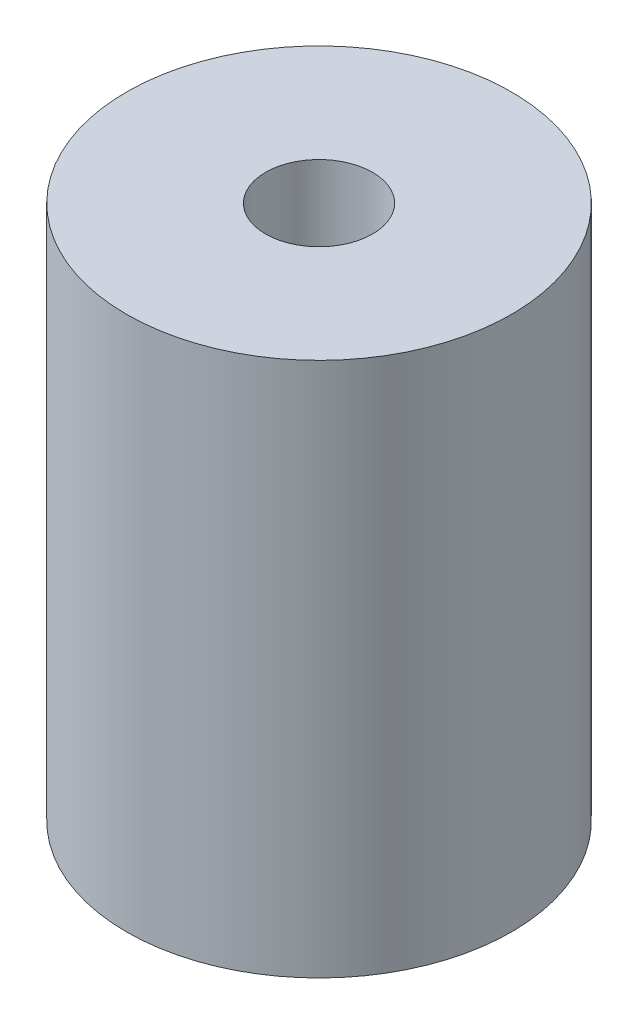
ISO-10303-21;
HEADER;
FILE_DESCRIPTION(('STEP AP214'),'2;1');
FILE_NAME('part.step','',(''),(''),'','','');
FILE_SCHEMA(('AUTOMOTIVE_DESIGN { 1 0 10303 214 1 1 1 1 }'));
ENDSEC;
DATA;
#1=APPLICATION_CONTEXT('core data for automotive mechanical design processes');
#2=APPLICATION_PROTOCOL_DEFINITION('international standard','automotive_design',2000,#1);
#3=PRODUCT_CONTEXT('',#1,'mechanical');
#4=PRODUCT('Part','Part','',(#3));
#5=PRODUCT_RELATED_PRODUCT_CATEGORY('part','',(#4));
#6=PRODUCT_DEFINITION_FORMATION('','',#4);
#7=PRODUCT_DEFINITION_CONTEXT('part definition',#1,'design');
#8=PRODUCT_DEFINITION('design','',#6,#7);
#9=PRODUCT_DEFINITION_SHAPE('','',#8);
#10=(LENGTH_UNIT() NAMED_UNIT(*) SI_UNIT(.MILLI.,.METRE.));
#11=(NAMED_UNIT(*) PLANE_ANGLE_UNIT() SI_UNIT($,.RADIAN.));
#12=(NAMED_UNIT(*) SI_UNIT($,.STERADIAN.) SOLID_ANGLE_UNIT());
#13=UNCERTAINTY_MEASURE_WITH_UNIT(LENGTH_MEASURE(1.E-05),#10,'distance_accuracy_value','');
#14=(GEOMETRIC_REPRESENTATION_CONTEXT(3) GLOBAL_UNCERTAINTY_ASSIGNED_CONTEXT((#13)) GLOBAL_UNIT_ASSIGNED_CONTEXT((#10,
#11,#12)) REPRESENTATION_CONTEXT('',''));
#15=CARTESIAN_POINT('',(0.,0.,0.));
#16=DIRECTION('',(0.,0.,1.));
#17=DIRECTION('',(1.,0.,0.));
#18=AXIS2_PLACEMENT_3D('',#15,#16,#17);
#19=CARTESIAN_POINT('',(0.,25.,0.));
#20=DIRECTION('',(0.,-1.,0.));
#21=DIRECTION('',(0.,0.,-1.));
#22=AXIS2_PLACEMENT_3D('',#19,#20,#21);
#23=CYLINDRICAL_SURFACE('',#22,2.5);
#24=CARTESIAN_POINT('',(0.,25.,0.));
#25=DIRECTION('',(0.,1.,0.));
#26=DIRECTION('',(0.,0.,1.));
#27=AXIS2_PLACEMENT_3D('',#24,#25,#26);
#28=CIRCLE('',#27,2.5);
#29=CARTESIAN_POINT('',(0.,25.,2.5));
#30=VERTEX_POINT('',#29);
#31=EDGE_CURVE('E43',#30,#30,#28,.T.);
#32=ORIENTED_EDGE('',*,*,#31,.T.);
#33=EDGE_LOOP('',(#32));
#34=FACE_BOUND('',#33,.T.);
#35=CARTESIAN_POINT('',(0.,10.,0.));
#36=DIRECTION('',(0.,-1.,0.));
#37=DIRECTION('',(0.,0.,-1.));
#38=AXIS2_PLACEMENT_3D('',#35,#36,#37);
#39=CIRCLE('',#38,2.5);
#40=CARTESIAN_POINT('',(0.,10.,-2.5));
#41=VERTEX_POINT('',#40);
#42=EDGE_CURVE('E34',#41,#41,#39,.T.);
#43=ORIENTED_EDGE('',*,*,#42,.T.);
#44=EDGE_LOOP('',(#43));
#45=FACE_BOUND('',#44,.T.);
#46=ADVANCED_FACE('F30',(#34,#45),#23,.F.);
#47=CARTESIAN_POINT('',(0.,25.,0.));
#48=DIRECTION('',(0.,1.,0.));
#49=DIRECTION('',(0.,0.,1.));
#50=AXIS2_PLACEMENT_3D('',#47,#48,#49);
#51=PLANE('',#50);
#52=CARTESIAN_POINT('',(0.,25.,0.));
#53=DIRECTION('',(0.,1.,0.));
#54=DIRECTION('',(0.,0.,1.));
#55=AXIS2_PLACEMENT_3D('',#52,#53,#54);
#56=CIRCLE('',#55,9.);
#57=CARTESIAN_POINT('',(0.,25.,9.));
#58=VERTEX_POINT('',#57);
#59=EDGE_CURVE('E10',#58,#58,#56,.T.);
#60=ORIENTED_EDGE('',*,*,#59,.T.);
#61=EDGE_LOOP('',(#60));
#62=FACE_BOUND('',#61,.T.);
#63=ORIENTED_EDGE('',*,*,#31,.F.);
#64=EDGE_LOOP('',(#63));
#65=FACE_BOUND('',#64,.T.);
#66=ADVANCED_FACE('F68',(#62,#65),#51,.T.);
#67=CARTESIAN_POINT('',(0.,0.,0.));
#68=DIRECTION('',(0.,1.,0.));
#69=DIRECTION('',(0.,0.,1.));
#70=AXIS2_PLACEMENT_3D('',#67,#68,#69);
#71=PLANE('',#70);
#72=CARTESIAN_POINT('',(0.,0.,0.));
#73=DIRECTION('',(0.,-1.,0.));
#74=DIRECTION('',(0.,0.,-1.));
#75=AXIS2_PLACEMENT_3D('',#72,#73,#74);
#76=CIRCLE('',#75,4.);
#77=CARTESIAN_POINT('',(0.,0.,-4.));
#78=VERTEX_POINT('',#77);
#79=EDGE_CURVE('E47',#78,#78,#76,.T.);
#80=ORIENTED_EDGE('',*,*,#79,.F.);
#81=EDGE_LOOP('',(#80));
#82=FACE_BOUND('',#81,.T.);
#83=CARTESIAN_POINT('',(0.,0.,0.));
#84=DIRECTION('',(0.,1.,0.));
#85=DIRECTION('',(0.,0.,1.));
#86=AXIS2_PLACEMENT_3D('',#83,#84,#85);
#87=CIRCLE('',#86,9.);
#88=CARTESIAN_POINT('',(0.,0.,9.));
#89=VERTEX_POINT('',#88);
#90=EDGE_CURVE('E38',#89,#89,#87,.T.);
#91=ORIENTED_EDGE('',*,*,#90,.F.);
#92=EDGE_LOOP('',(#91));
#93=FACE_BOUND('',#92,.T.);
#94=ADVANCED_FACE('F74',(#82,#93),#71,.F.);
#95=CARTESIAN_POINT('',(0.,25.,0.));
#96=DIRECTION('',(0.,-1.,0.));
#97=DIRECTION('',(0.,0.,-1.));
#98=AXIS2_PLACEMENT_3D('',#95,#96,#97);
#99=CYLINDRICAL_SURFACE('',#98,9.);
#100=ORIENTED_EDGE('',*,*,#59,.F.);
#101=EDGE_LOOP('',(#100));
#102=FACE_BOUND('',#101,.T.);
#103=ORIENTED_EDGE('',*,*,#90,.T.);
#104=EDGE_LOOP('',(#103));
#105=FACE_BOUND('',#104,.T.);
#106=ADVANCED_FACE('F32',(#102,#105),#99,.T.);
#107=CARTESIAN_POINT('',(0.,10.,0.));
#108=DIRECTION('',(0.,-1.,0.));
#109=DIRECTION('',(0.,0.,-1.));
#110=AXIS2_PLACEMENT_3D('',#107,#108,#109);
#111=CYLINDRICAL_SURFACE('',#110,4.);
#112=CARTESIAN_POINT('',(0.,10.,0.));
#113=DIRECTION('',(0.,-1.,0.));
#114=DIRECTION('',(0.,0.,-1.));
#115=AXIS2_PLACEMENT_3D('',#112,#113,#114);
#116=CIRCLE('',#115,4.);
#117=CARTESIAN_POINT('',(0.,10.,-4.));
#118=VERTEX_POINT('',#117);
#119=EDGE_CURVE('E50',#118,#118,#116,.T.);
#120=ORIENTED_EDGE('',*,*,#119,.F.);
#121=EDGE_LOOP('',(#120));
#122=FACE_BOUND('',#121,.T.);
#123=ORIENTED_EDGE('',*,*,#79,.T.);
#124=EDGE_LOOP('',(#123));
#125=FACE_BOUND('',#124,.T.);
#126=ADVANCED_FACE('F60',(#122,#125),#111,.F.);
#127=CARTESIAN_POINT('',(0.,10.,0.));
#128=DIRECTION('',(0.,-1.,0.));
#129=DIRECTION('',(0.,0.,-1.));
#130=AXIS2_PLACEMENT_3D('',#127,#128,#129);
#131=PLANE('',#130);
#132=ORIENTED_EDGE('',*,*,#42,.F.);
#133=EDGE_LOOP('',(#132));
#134=FACE_BOUND('',#133,.T.);
#135=ORIENTED_EDGE('',*,*,#119,.T.);
#136=EDGE_LOOP('',(#135));
#137=FACE_BOUND('',#136,.T.);
#138=ADVANCED_FACE('F58',(#134,#137),#131,.T.);
#139=CLOSED_SHELL('',(#46,#66,#94,#106,#126,#138));
#140=MANIFOLD_SOLID_BREP('B2',#139);
#141=ADVANCED_BREP_SHAPE_REPRESENTATION('',(#18,#140),#14);
#142=SHAPE_DEFINITION_REPRESENTATION(#9,#141);
ENDSEC;
END-ISO-10303-21;
